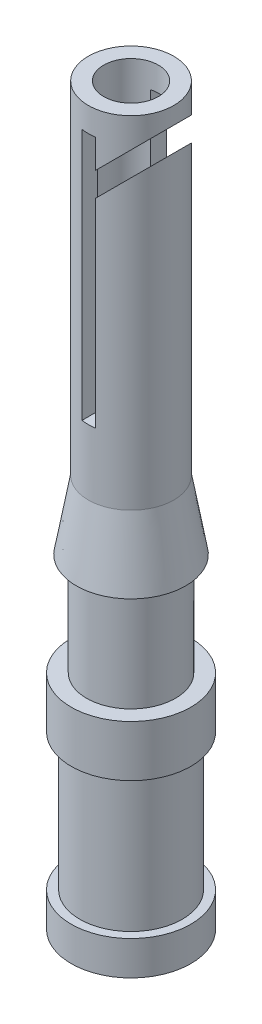
ISO-10303-21;
HEADER;
FILE_DESCRIPTION(('STEP AP214'),'2;1');
FILE_NAME('part.step','',(''),(''),'','','');
FILE_SCHEMA(('AUTOMOTIVE_DESIGN { 1 0 10303 214 1 1 1 1 }'));
ENDSEC;
DATA;
#1=APPLICATION_CONTEXT('core data for automotive mechanical design processes');
#2=APPLICATION_PROTOCOL_DEFINITION('international standard','automotive_design',2000,#1);
#3=PRODUCT_CONTEXT('',#1,'mechanical');
#4=PRODUCT('Part','Part','',(#3));
#5=PRODUCT_RELATED_PRODUCT_CATEGORY('part','',(#4));
#6=PRODUCT_DEFINITION_FORMATION('','',#4);
#7=PRODUCT_DEFINITION_CONTEXT('part definition',#1,'design');
#8=PRODUCT_DEFINITION('design','',#6,#7);
#9=PRODUCT_DEFINITION_SHAPE('','',#8);
#10=(LENGTH_UNIT() NAMED_UNIT(*) SI_UNIT(.MILLI.,.METRE.));
#11=(NAMED_UNIT(*) PLANE_ANGLE_UNIT() SI_UNIT($,.RADIAN.));
#12=(NAMED_UNIT(*) SI_UNIT($,.STERADIAN.) SOLID_ANGLE_UNIT());
#13=UNCERTAINTY_MEASURE_WITH_UNIT(LENGTH_MEASURE(1.E-05),#10,'distance_accuracy_value','');
#14=(GEOMETRIC_REPRESENTATION_CONTEXT(3) GLOBAL_UNCERTAINTY_ASSIGNED_CONTEXT((#13)) GLOBAL_UNIT_ASSIGNED_CONTEXT((#10,
#11,#12)) REPRESENTATION_CONTEXT('',''));
#15=CARTESIAN_POINT('',(0.,0.,0.));
#16=DIRECTION('',(0.,0.,1.));
#17=DIRECTION('',(1.,0.,0.));
#18=AXIS2_PLACEMENT_3D('',#15,#16,#17);
#19=CARTESIAN_POINT('',(1.2974998703602,8.000000590086,-14.7475));
#20=DIRECTION('',(0.,-1.,0.));
#21=DIRECTION('',(0.,0.,1.));
#22=AXIS2_PLACEMENT_3D('',#19,#20,#21);
#23=PLANE('',#22);
#24=CARTESIAN_POINT('',(0.49999987035989,8.00000059008601,-13.95));
#25=DIRECTION('',(0.,1.,0.));
#26=DIRECTION('',(-1.,0.,0.));
#27=AXIS2_PLACEMENT_3D('',#24,#25,#26);
#28=CIRCLE('',#27,0.725000000000362);
#29=CARTESIAN_POINT('',(-0.225000129640472,8.000000590086,-13.95));
#30=VERTEX_POINT('',#29);
#31=EDGE_CURVE('E20',#30,#30,#28,.T.);
#32=ORIENTED_EDGE('',*,*,#31,.F.);
#33=EDGE_LOOP('',(#32));
#34=FACE_BOUND('',#33,.T.);
#35=ADVANCED_FACE('F16',(#34),#23,.T.);
#36=CARTESIAN_POINT('',(0.499999870360045,5.90085959E-07,-13.95));
#37=DIRECTION('',(0.,1.,0.));
#38=DIRECTION('',(-1.,0.,0.));
#39=AXIS2_PLACEMENT_3D('',#36,#37,#38);
#40=CYLINDRICAL_SURFACE('',#39,0.725000000000362);
#41=CARTESIAN_POINT('',(0.499999870360045,5.90085987E-07,-13.95));
#42=DIRECTION('',(0.,1.,0.));
#43=DIRECTION('',(-1.,0.,0.));
#44=AXIS2_PLACEMENT_3D('',#41,#42,#43);
#45=CIRCLE('',#44,0.725000000000362);
#46=CARTESIAN_POINT('',(-0.225000129640317,5.90085973E-07,-13.95));
#47=VERTEX_POINT('',#46);
#48=EDGE_CURVE('E214',#47,#47,#45,.T.);
#49=ORIENTED_EDGE('',*,*,#48,.F.);
#50=EDGE_LOOP('',(#49));
#51=FACE_BOUND('',#50,.T.);
#52=ORIENTED_EDGE('',*,*,#31,.T.);
#53=EDGE_LOOP('',(#52));
#54=FACE_BOUND('',#53,.T.);
#55=ADVANCED_FACE('F221',(#51,#54),#40,.F.);
#56=CARTESIAN_POINT('',(2.4249998703601,5.90085973E-07,-15.875));
#57=DIRECTION('',(0.,-1.,0.));
#58=DIRECTION('',(0.,0.,1.));
#59=AXIS2_PLACEMENT_3D('',#56,#57,#58);
#60=PLANE('',#59);
#61=ORIENTED_EDGE('',*,*,#48,.T.);
#62=EDGE_LOOP('',(#61));
#63=FACE_BOUND('',#62,.T.);
#64=CARTESIAN_POINT('',(0.499999870360085,5.90085986150457E-07,-13.95));
#65=DIRECTION('',(0.,-1.,0.));
#66=DIRECTION('',(0.,0.,-1.));
#67=AXIS2_PLACEMENT_3D('',#64,#65,#66);
#68=CIRCLE('',#67,1.75000000000008);
#69=CARTESIAN_POINT('',(0.499999870360085,5.90085963114966E-07,-15.7000000000001));
#70=VERTEX_POINT('',#69);
#71=EDGE_CURVE('E212',#70,#70,#68,.F.);
#72=ORIENTED_EDGE('',*,*,#71,.F.);
#73=EDGE_LOOP('',(#72));
#74=FACE_BOUND('',#73,.T.);
#75=ADVANCED_FACE('F231',(#63,#74),#60,.T.);
#76=CARTESIAN_POINT('',(0.499999870360078,1.00000059008601,-13.95));
#77=DIRECTION('',(0.,-1.,0.));
#78=DIRECTION('',(0.,0.,-1.));
#79=AXIS2_PLACEMENT_3D('',#76,#77,#78);
#80=CYLINDRICAL_SURFACE('',#79,1.75000000000008);
#81=CARTESIAN_POINT('',(0.499999870360078,1.00000059008601,-13.95));
#82=DIRECTION('',(0.,-1.,0.));
#83=DIRECTION('',(0.,0.,-1.));
#84=AXIS2_PLACEMENT_3D('',#81,#82,#83);
#85=CIRCLE('',#84,1.75000000000008);
#86=CARTESIAN_POINT('',(0.499999870360078,1.00000059008599,-15.7000000000001));
#87=VERTEX_POINT('',#86);
#88=EDGE_CURVE('E209',#87,#87,#85,.F.);
#89=ORIENTED_EDGE('',*,*,#88,.F.);
#90=EDGE_LOOP('',(#89));
#91=FACE_BOUND('',#90,.T.);
#92=ORIENTED_EDGE('',*,*,#71,.T.);
#93=EDGE_LOOP('',(#92));
#94=FACE_BOUND('',#93,.T.);
#95=ADVANCED_FACE('F374',(#91,#94),#80,.T.);
#96=CARTESIAN_POINT('',(-1.4250001296399,1.000000590086,-15.875));
#97=DIRECTION('',(0.,1.,0.));
#98=DIRECTION('',(0.,0.,1.));
#99=AXIS2_PLACEMENT_3D('',#96,#97,#98);
#100=PLANE('',#99);
#101=CARTESIAN_POINT('',(0.499999870360038,1.00000059008603,-13.9500000000002));
#102=DIRECTION('',(0.,-1.,0.));
#103=DIRECTION('',(0.,0.,-1.));
#104=AXIS2_PLACEMENT_3D('',#101,#102,#103);
#105=CIRCLE('',#104,1.50000000000025);
#106=CARTESIAN_POINT('',(0.499999870360038,1.00000059008609,-15.4500000000004));
#107=VERTEX_POINT('',#106);
#108=EDGE_CURVE('E206',#107,#107,#105,.F.);
#109=ORIENTED_EDGE('',*,*,#108,.F.);
#110=EDGE_LOOP('',(#109));
#111=FACE_BOUND('',#110,.T.);
#112=ORIENTED_EDGE('',*,*,#88,.T.);
#113=EDGE_LOOP('',(#112));
#114=FACE_BOUND('',#113,.T.);
#115=ADVANCED_FACE('F370',(#111,#114),#100,.T.);
#116=CARTESIAN_POINT('',(0.499999870359948,5.00000059008593,-13.95));
#117=DIRECTION('',(0.,-1.,0.));
#118=DIRECTION('',(0.,0.,-1.));
#119=AXIS2_PLACEMENT_3D('',#116,#117,#118);
#120=CYLINDRICAL_SURFACE('',#119,1.50000000000025);
#121=CARTESIAN_POINT('',(0.499999870359948,5.00000059008604,-13.95));
#122=DIRECTION('',(0.,-1.,0.));
#123=DIRECTION('',(0.,0.,-1.));
#124=AXIS2_PLACEMENT_3D('',#121,#122,#123);
#125=CIRCLE('',#124,1.50000000000025);
#126=CARTESIAN_POINT('',(0.499999870359948,5.00000059008609,-15.4500000000003));
#127=VERTEX_POINT('',#126);
#128=EDGE_CURVE('E203',#127,#127,#125,.F.);
#129=ORIENTED_EDGE('',*,*,#128,.F.);
#130=EDGE_LOOP('',(#129));
#131=FACE_BOUND('',#130,.T.);
#132=ORIENTED_EDGE('',*,*,#108,.T.);
#133=EDGE_LOOP('',(#132));
#134=FACE_BOUND('',#133,.T.);
#135=ADVANCED_FACE('F366',(#131,#134),#120,.T.);
#136=CARTESIAN_POINT('',(2.4249998703599,5.000000590086,-15.875));
#137=DIRECTION('',(0.,-1.,0.));
#138=DIRECTION('',(0.,0.,1.));
#139=AXIS2_PLACEMENT_3D('',#136,#137,#138);
#140=PLANE('',#139);
#141=ORIENTED_EDGE('',*,*,#128,.T.);
#142=EDGE_LOOP('',(#141));
#143=FACE_BOUND('',#142,.T.);
#144=CARTESIAN_POINT('',(0.499999870359954,5.00000059008604,-13.9500000000001));
#145=DIRECTION('',(0.,-1.,0.));
#146=DIRECTION('',(0.,0.,-1.));
#147=AXIS2_PLACEMENT_3D('',#144,#145,#146);
#148=CIRCLE('',#147,1.74999999999999);
#149=CARTESIAN_POINT('',(0.499999870359954,5.00000059008609,-15.7000000000001));
#150=VERTEX_POINT('',#149);
#151=EDGE_CURVE('E200',#150,#150,#148,.F.);
#152=ORIENTED_EDGE('',*,*,#151,.F.);
#153=EDGE_LOOP('',(#152));
#154=FACE_BOUND('',#153,.T.);
#155=ADVANCED_FACE('F362',(#143,#154),#140,.T.);
#156=CARTESIAN_POINT('',(0.499999870359925,6.50000059008593,-13.95));
#157=DIRECTION('',(0.,-1.,0.));
#158=DIRECTION('',(0.,0.,-1.));
#159=AXIS2_PLACEMENT_3D('',#156,#157,#158);
#160=CYLINDRICAL_SURFACE('',#159,1.74999999999999);
#161=CARTESIAN_POINT('',(0.499999870359925,6.50000059008603,-13.95));
#162=DIRECTION('',(0.,-1.,0.));
#163=DIRECTION('',(0.,0.,-1.));
#164=AXIS2_PLACEMENT_3D('',#161,#162,#163);
#165=CIRCLE('',#164,1.74999999999999);
#166=CARTESIAN_POINT('',(0.499999870359925,6.50000059008609,-15.7));
#167=VERTEX_POINT('',#166);
#168=EDGE_CURVE('E197',#167,#167,#165,.F.);
#169=ORIENTED_EDGE('',*,*,#168,.F.);
#170=EDGE_LOOP('',(#169));
#171=FACE_BOUND('',#170,.T.);
#172=ORIENTED_EDGE('',*,*,#151,.T.);
#173=EDGE_LOOP('',(#172));
#174=FACE_BOUND('',#173,.T.);
#175=ADVANCED_FACE('F358',(#171,#174),#160,.T.);
#176=CARTESIAN_POINT('',(-1.4250001296399,6.500000590086,-15.875));
#177=DIRECTION('',(0.,1.,0.));
#178=DIRECTION('',(0.,0.,1.));
#179=AXIS2_PLACEMENT_3D('',#176,#177,#178);
#180=PLANE('',#179);
#181=CARTESIAN_POINT('',(0.499999870360003,6.50000059008603,-13.9500000000001));
#182=DIRECTION('',(0.,-1.,0.));
#183=DIRECTION('',(0.,0.,-1.));
#184=AXIS2_PLACEMENT_3D('',#181,#182,#183);
#185=CIRCLE('',#184,1.30000000000019);
#186=CARTESIAN_POINT('',(0.499999870360003,6.50000059008609,-15.2500000000003));
#187=VERTEX_POINT('',#186);
#188=EDGE_CURVE('E194',#187,#187,#185,.F.);
#189=ORIENTED_EDGE('',*,*,#188,.F.);
#190=EDGE_LOOP('',(#189));
#191=FACE_BOUND('',#190,.T.);
#192=ORIENTED_EDGE('',*,*,#168,.T.);
#193=EDGE_LOOP('',(#192));
#194=FACE_BOUND('',#193,.T.);
#195=ADVANCED_FACE('F354',(#191,#194),#180,.T.);
#196=CARTESIAN_POINT('',(0.499999870359924,9.50000059008593,-13.95));
#197=DIRECTION('',(0.,-1.,0.));
#198=DIRECTION('',(0.,0.,-1.));
#199=AXIS2_PLACEMENT_3D('',#196,#197,#198);
#200=CYLINDRICAL_SURFACE('',#199,1.30000000000019);
#201=CARTESIAN_POINT('',(0.499999870359924,9.50000059008604,-13.95));
#202=DIRECTION('',(0.,-1.,0.));
#203=DIRECTION('',(0.,0.,-1.));
#204=AXIS2_PLACEMENT_3D('',#201,#202,#203);
#205=CIRCLE('',#204,1.30000000000019);
#206=CARTESIAN_POINT('',(0.499999870359924,9.5000005900861,-15.2500000000002));
#207=VERTEX_POINT('',#206);
#208=EDGE_CURVE('E191',#207,#207,#205,.F.);
#209=ORIENTED_EDGE('',*,*,#208,.F.);
#210=EDGE_LOOP('',(#209));
#211=FACE_BOUND('',#210,.T.);
#212=ORIENTED_EDGE('',*,*,#188,.T.);
#213=EDGE_LOOP('',(#212));
#214=FACE_BOUND('',#213,.T.);
#215=ADVANCED_FACE('F350',(#211,#214),#200,.T.);
#216=CARTESIAN_POINT('',(-0.38000012964019,12.500000590086,-14.83));
#217=DIRECTION('',(0.,1.,0.));
#218=DIRECTION('',(0.,0.,1.));
#219=AXIS2_PLACEMENT_3D('',#216,#217,#218);
#220=PLANE('',#219);
#221=CARTESIAN_POINT('',(0.499999870359857,12.500000590086,-13.95));
#222=DIRECTION('',(0.,1.,0.));
#223=DIRECTION('',(0.,0.,1.));
#224=AXIS2_PLACEMENT_3D('',#221,#222,#223);
#225=CIRCLE('',#224,0.800000000000202);
#226=CARTESIAN_POINT('',(0.499999870359857,12.500000590086,-13.1499999999998));
#227=VERTEX_POINT('',#226);
#228=EDGE_CURVE('E188',#227,#227,#225,.F.);
#229=ORIENTED_EDGE('',*,*,#228,.F.);
#230=EDGE_LOOP('',(#229));
#231=FACE_BOUND('',#230,.T.);
#232=ADVANCED_FACE('F346',(#231),#220,.T.);
#233=CARTESIAN_POINT('',(2.2599998703599,9.500000590086,-15.71));
#234=DIRECTION('',(0.,-1.,0.));
#235=DIRECTION('',(0.,0.,1.));
#236=AXIS2_PLACEMENT_3D('',#233,#234,#235);
#237=PLANE('',#236);
#238=ORIENTED_EDGE('',*,*,#208,.T.);
#239=EDGE_LOOP('',(#238));
#240=FACE_BOUND('',#239,.T.);
#241=CARTESIAN_POINT('',(0.499999870359763,9.500000590086,-13.95));
#242=DIRECTION('',(0.,-1.,0.));
#243=DIRECTION('',(0.,0.,-1.));
#244=AXIS2_PLACEMENT_3D('',#241,#242,#243);
#245=CIRCLE('',#244,1.59999999999985);
#246=CARTESIAN_POINT('',(0.499999870359763,9.500000590086,-15.5499999999998));
#247=VERTEX_POINT('',#246);
#248=EDGE_CURVE('E123',#247,#247,#245,.F.);
#249=ORIENTED_EDGE('',*,*,#248,.F.);
#250=EDGE_LOOP('',(#249));
#251=FACE_BOUND('',#250,.T.);
#252=ADVANCED_FACE('F342',(#240,#251),#237,.T.);
#253=CARTESIAN_POINT('',(0.499999870359857,12.500000590086,-13.95));
#254=DIRECTION('',(0.,1.,0.));
#255=DIRECTION('',(0.,0.,1.));
#256=AXIS2_PLACEMENT_3D('',#253,#254,#255);
#257=CYLINDRICAL_SURFACE('',#256,0.800000000000202);
#258=ORIENTED_EDGE('',*,*,#228,.T.);
#259=EDGE_LOOP('',(#258));
#260=FACE_BOUND('',#259,.T.);
#261=DIRECTION('',(0.,-1.,0.));
#262=VECTOR('',#261,1.);
#263=CARTESIAN_POINT('',(0.29999987035979,17.1000005900855,-13.175403330759));
#264=LINE('',#263,#262);
#265=CARTESIAN_POINT('',(0.29999987035972,20.787479403584,-13.1754033307587));
#266=VERTEX_POINT('',#265);
#267=CARTESIAN_POINT('',(0.29999987035986,13.412521776587,-13.1754033307587));
#268=VERTEX_POINT('',#267);
#269=EDGE_CURVE('E104',#266,#268,#264,.T.);
#270=ORIENTED_EDGE('',*,*,#269,.T.);
#271=CARTESIAN_POINT('',(0.499999870359857,13.412521776587,-13.95));
#272=DIRECTION('',(0.,1.,0.));
#273=DIRECTION('',(0.,0.,1.));
#274=AXIS2_PLACEMENT_3D('',#271,#272,#273);
#275=CIRCLE('',#274,0.800000000000202);
#276=CARTESIAN_POINT('',(0.69999987035986,13.412521776587,-13.1754033307587));
#277=VERTEX_POINT('',#276);
#278=EDGE_CURVE('E106',#268,#277,#275,.T.);
#279=ORIENTED_EDGE('',*,*,#278,.T.);
#280=DIRECTION('',(0.,1.,0.));
#281=VECTOR('',#280,1.);
#282=CARTESIAN_POINT('',(0.699999870359805,16.327707792743,-13.175403330759));
#283=LINE('',#282,#281);
#284=CARTESIAN_POINT('',(0.69999987035975,19.242893808899,-13.1754033307586));
#285=VERTEX_POINT('',#284);
#286=EDGE_CURVE('E110',#277,#285,#283,.T.);
#287=ORIENTED_EDGE('',*,*,#286,.T.);
#288=CARTESIAN_POINT('',(0.499999870359857,19.0428938088991,-13.95));
#289=DIRECTION('',(0.707106781186564,-0.707106781186531,0.));
#290=DIRECTION('',(0.707106781186531,0.707106781186564,0.));
#291=AXIS2_PLACEMENT_3D('',#288,#289,#290);
#292=ELLIPSE('',#291,1.13137084989879,0.800000000000202);
#293=CARTESIAN_POINT('',(0.69999987035975,19.242893808899,-14.7245966692419));
#294=VERTEX_POINT('',#293);
#295=EDGE_CURVE('E173',#285,#294,#292,.F.);
#296=ORIENTED_EDGE('',*,*,#295,.T.);
#297=DIRECTION('',(0.,-1.,0.));
#298=VECTOR('',#297,1.);
#299=CARTESIAN_POINT('',(0.699999870359805,16.327707792743,-14.724596669242));
#300=LINE('',#299,#298);
#301=CARTESIAN_POINT('',(0.69999987035986,13.412521776587,-14.7245966692418));
#302=VERTEX_POINT('',#301);
#303=EDGE_CURVE('E135',#294,#302,#300,.T.);
#304=ORIENTED_EDGE('',*,*,#303,.T.);
#305=CARTESIAN_POINT('',(0.499999870359857,13.412521776587,-13.95));
#306=DIRECTION('',(0.,1.,0.));
#307=DIRECTION('',(0.,0.,1.));
#308=AXIS2_PLACEMENT_3D('',#305,#306,#307);
#309=CIRCLE('',#308,0.800000000000202);
#310=CARTESIAN_POINT('',(0.29999987035986,13.412521776587,-14.7245966692418));
#311=VERTEX_POINT('',#310);
#312=EDGE_CURVE('E175',#302,#311,#309,.T.);
#313=ORIENTED_EDGE('',*,*,#312,.T.);
#314=DIRECTION('',(0.,1.,0.));
#315=VECTOR('',#314,1.);
#316=CARTESIAN_POINT('',(0.29999987035979,17.1000005900855,-14.724596669242));
#317=LINE('',#316,#315);
#318=CARTESIAN_POINT('',(0.29999987035972,20.787479403584,-14.7245966692418));
#319=VERTEX_POINT('',#318);
#320=EDGE_CURVE('E139',#311,#319,#317,.T.);
#321=ORIENTED_EDGE('',*,*,#320,.T.);
#322=CARTESIAN_POINT('',(0.499999870359857,20.787479403584,-13.95));
#323=DIRECTION('',(0.,1.,0.));
#324=DIRECTION('',(0.,0.,1.));
#325=AXIS2_PLACEMENT_3D('',#322,#323,#324);
#326=CIRCLE('',#325,0.800000000000202);
#327=CARTESIAN_POINT('',(0.69999987035972,20.787479403584,-14.7245966692419));
#328=VERTEX_POINT('',#327);
#329=EDGE_CURVE('E177',#319,#328,#326,.F.);
#330=ORIENTED_EDGE('',*,*,#329,.T.);
#331=DIRECTION('',(0.,-1.,0.));
#332=VECTOR('',#331,1.);
#333=CARTESIAN_POINT('',(0.699999870359725,20.368739996835,-14.724596669242));
#334=LINE('',#333,#332);
#335=CARTESIAN_POINT('',(0.69999987035973,19.950000590086,-14.7245966692419));
#336=VERTEX_POINT('',#335);
#337=EDGE_CURVE('E143',#328,#336,#334,.T.);
#338=ORIENTED_EDGE('',*,*,#337,.T.);
#339=CARTESIAN_POINT('',(0.499999870359857,19.7500005900861,-13.95));
#340=DIRECTION('',(-0.707106781186557,0.707106781186538,0.));
#341=DIRECTION('',(0.707106781186538,0.707106781186557,0.));
#342=AXIS2_PLACEMENT_3D('',#339,#340,#341);
#343=ELLIPSE('',#342,1.13137084989878,0.800000000000202);
#344=CARTESIAN_POINT('',(0.69999987035973,19.950000590086,-13.1754033307586));
#345=VERTEX_POINT('',#344);
#346=EDGE_CURVE('E179',#336,#345,#343,.F.);
#347=ORIENTED_EDGE('',*,*,#346,.T.);
#348=DIRECTION('',(0.,1.,0.));
#349=VECTOR('',#348,1.);
#350=CARTESIAN_POINT('',(0.699999870359725,20.368739996835,-13.175403330759));
#351=LINE('',#350,#349);
#352=CARTESIAN_POINT('',(0.69999987035972,20.787479403584,-13.1754033307586));
#353=VERTEX_POINT('',#352);
#354=EDGE_CURVE('E147',#345,#353,#351,.T.);
#355=ORIENTED_EDGE('',*,*,#354,.T.);
#356=CARTESIAN_POINT('',(0.499999870359857,20.787479403584,-13.95));
#357=DIRECTION('',(0.,1.,0.));
#358=DIRECTION('',(0.,0.,1.));
#359=AXIS2_PLACEMENT_3D('',#356,#357,#358);
#360=CIRCLE('',#359,0.800000000000202);
#361=EDGE_CURVE('E181',#353,#266,#360,.F.);
#362=ORIENTED_EDGE('',*,*,#361,.T.);
#363=EDGE_LOOP('',(#270,#279,#287,#296,#304,#313,#321,#330,#338,#347,#355,#362));
#364=FACE_BOUND('',#363,.T.);
#365=CARTESIAN_POINT('',(0.499999870359857,21.500000590086,-13.95));
#366=DIRECTION('',(0.,1.,0.));
#367=DIRECTION('',(0.,0.,1.));
#368=AXIS2_PLACEMENT_3D('',#365,#366,#367);
#369=CIRCLE('',#368,0.800000000000202);
#370=CARTESIAN_POINT('',(0.499999870359857,21.500000590086,-13.1499999999998));
#371=VERTEX_POINT('',#370);
#372=EDGE_CURVE('E185',#371,#371,#369,.F.);
#373=ORIENTED_EDGE('',*,*,#372,.F.);
#374=EDGE_LOOP('',(#373));
#375=FACE_BOUND('',#374,.T.);
#376=ADVANCED_FACE('F108',(#260,#364,#375),#257,.F.);
#377=CARTESIAN_POINT('',(-0.87500012964023,21.500000590086,-15.325));
#378=DIRECTION('',(0.,1.,0.));
#379=DIRECTION('',(0.,0.,1.));
#380=AXIS2_PLACEMENT_3D('',#377,#378,#379);
#381=PLANE('',#380);
#382=ORIENTED_EDGE('',*,*,#372,.T.);
#383=EDGE_LOOP('',(#382));
#384=FACE_BOUND('',#383,.T.);
#385=CARTESIAN_POINT('',(0.499999870359726,21.500000590086,-13.95));
#386=DIRECTION('',(0.,-1.,0.));
#387=DIRECTION('',(0.,0.,-1.));
#388=AXIS2_PLACEMENT_3D('',#385,#386,#387);
#389=CIRCLE('',#388,1.25000000000014);
#390=CARTESIAN_POINT('',(0.499999870359726,21.500000590086,-15.2000000000001));
#391=VERTEX_POINT('',#390);
#392=EDGE_CURVE('E169',#391,#391,#389,.T.);
#393=ORIENTED_EDGE('',*,*,#392,.F.);
#394=EDGE_LOOP('',(#393));
#395=FACE_BOUND('',#394,.T.);
#396=ADVANCED_FACE('F336',(#384,#395),#381,.T.);
#397=CARTESIAN_POINT('',(0.499999870359763,11.500000590086,-13.95));
#398=DIRECTION('',(0.,-1.,0.));
#399=DIRECTION('',(0.,0.,-1.));
#400=AXIS2_PLACEMENT_3D('',#397,#398,#399);
#401=CONICAL_SURFACE('',#400,1.24999999999999,0.173245666452293);
#402=CARTESIAN_POINT('',(0.499999870359763,11.500000590086,-13.95));
#403=DIRECTION('',(0.,1.,0.));
#404=DIRECTION('',(0.,0.,1.));
#405=AXIS2_PLACEMENT_3D('',#402,#403,#404);
#406=CIRCLE('',#405,1.25000000000022);
#407=CARTESIAN_POINT('',(0.499999870359763,11.500000590086,-12.6999999999998));
#408=VERTEX_POINT('',#407);
#409=EDGE_CURVE('E172',#408,#408,#406,.T.);
#410=ORIENTED_EDGE('',*,*,#409,.F.);
#411=EDGE_LOOP('',(#410));
#412=FACE_BOUND('',#411,.T.);
#413=ORIENTED_EDGE('',*,*,#248,.T.);
#414=EDGE_LOOP('',(#413));
#415=FACE_BOUND('',#414,.T.);
#416=ADVANCED_FACE('F333',(#412,#415),#401,.T.);
#417=CARTESIAN_POINT('',(0.69999987035986,13.412521776587,-16.183896267925));
#418=DIRECTION('',(1.,0.,0.));
#419=DIRECTION('',(0.,1.,0.));
#420=AXIS2_PLACEMENT_3D('',#417,#418,#419);
#421=PLANE('',#420);
#422=DIRECTION('',(0.,-1.,0.));
#423=VECTOR('',#422,1.);
#424=CARTESIAN_POINT('',(0.699999870359507,16.500000590086,-12.7161037320747));
#425=LINE('',#424,#423);
#426=CARTESIAN_POINT('',(0.699999870359607,19.2428938088989,-12.7161037320747));
#427=VERTEX_POINT('',#426);
#428=CARTESIAN_POINT('',(0.699999870359707,13.412521776587,-12.7161037320745));
#429=VERTEX_POINT('',#428);
#430=EDGE_CURVE('E168',#427,#429,#425,.T.);
#431=ORIENTED_EDGE('',*,*,#430,.F.);
#432=DIRECTION('',(0.,0.,-1.));
#433=VECTOR('',#432,1.);
#434=CARTESIAN_POINT('',(0.69999987035975,19.242893808899,-13.95));
#435=LINE('',#434,#433);
#436=EDGE_CURVE('E121',#427,#285,#435,.T.);
#437=ORIENTED_EDGE('',*,*,#436,.T.);
#438=ORIENTED_EDGE('',*,*,#286,.F.);
#439=DIRECTION('',(0.,0.,1.));
#440=VECTOR('',#439,1.);
#441=CARTESIAN_POINT('',(0.69999987035986,13.412521776587,-13.95));
#442=LINE('',#441,#440);
#443=EDGE_CURVE('E115',#277,#429,#442,.T.);
#444=ORIENTED_EDGE('',*,*,#443,.T.);
#445=EDGE_LOOP('',(#431,#437,#438,#444));
#446=FACE_BOUND('',#445,.T.);
#447=ADVANCED_FACE('F118',(#446),#421,.F.);
#448=CARTESIAN_POINT('',(0.29999987035986,13.412521776587,-16.2));
#449=DIRECTION('',(0.,-1.,0.));
#450=DIRECTION('',(1.,0.,0.));
#451=AXIS2_PLACEMENT_3D('',#448,#449,#450);
#452=PLANE('',#451);
#453=CARTESIAN_POINT('',(0.499999870359726,13.412521776587,-13.95));
#454=DIRECTION('',(0.,-1.,0.));
#455=DIRECTION('',(0.,0.,-1.));
#456=AXIS2_PLACEMENT_3D('',#453,#454,#455);
#457=CIRCLE('',#456,1.25000000000014);
#458=CARTESIAN_POINT('',(0.299999870359821,13.412521776587,-12.7161037320745));
#459=VERTEX_POINT('',#458);
#460=EDGE_CURVE('E127',#429,#459,#457,.T.);
#461=ORIENTED_EDGE('',*,*,#460,.F.);
#462=ORIENTED_EDGE('',*,*,#443,.F.);
#463=ORIENTED_EDGE('',*,*,#278,.F.);
#464=DIRECTION('',(0.,0.,1.));
#465=VECTOR('',#464,1.);
#466=CARTESIAN_POINT('',(0.29999987035986,13.412521776587,-13.95));
#467=LINE('',#466,#465);
#468=EDGE_CURVE('E130',#268,#459,#467,.T.);
#469=ORIENTED_EDGE('',*,*,#468,.T.);
#470=EDGE_LOOP('',(#461,#462,#463,#469));
#471=FACE_BOUND('',#470,.T.);
#472=ADVANCED_FACE('F125',(#471),#452,.F.);
#473=CARTESIAN_POINT('',(0.29999987035972,20.787479403584,-16.183896267925));
#474=DIRECTION('',(-1.,0.,0.));
#475=DIRECTION('',(0.,-1.,0.));
#476=AXIS2_PLACEMENT_3D('',#473,#474,#475);
#477=PLANE('',#476);
#478=DIRECTION('',(0.,1.,0.));
#479=VECTOR('',#478,1.);
#480=CARTESIAN_POINT('',(0.299999870359748,16.500000590086,-12.7161037320747));
#481=LINE('',#480,#479);
#482=CARTESIAN_POINT('',(0.29999987035971,20.787479403584,-12.7161037320748));
#483=VERTEX_POINT('',#482);
#484=EDGE_CURVE('E166',#459,#483,#481,.T.);
#485=ORIENTED_EDGE('',*,*,#484,.F.);
#486=ORIENTED_EDGE('',*,*,#468,.F.);
#487=ORIENTED_EDGE('',*,*,#269,.F.);
#488=DIRECTION('',(0.,0.,1.));
#489=VECTOR('',#488,1.);
#490=CARTESIAN_POINT('',(0.29999987035972,20.787479403584,-13.95));
#491=LINE('',#490,#489);
#492=EDGE_CURVE('E149',#266,#483,#491,.T.);
#493=ORIENTED_EDGE('',*,*,#492,.T.);
#494=EDGE_LOOP('',(#485,#486,#487,#493));
#495=FACE_BOUND('',#494,.T.);
#496=ADVANCED_FACE('F270',(#495),#477,.F.);
#497=CARTESIAN_POINT('',(0.69999987035972,20.787479403584,-16.2));
#498=DIRECTION('',(0.,1.,0.));
#499=DIRECTION('',(-1.,0.,0.));
#500=AXIS2_PLACEMENT_3D('',#497,#498,#499);
#501=PLANE('',#500);
#502=CARTESIAN_POINT('',(0.499999870359726,20.787479403584,-13.95));
#503=DIRECTION('',(0.,-1.,0.));
#504=DIRECTION('',(0.,0.,-1.));
#505=AXIS2_PLACEMENT_3D('',#502,#503,#504);
#506=CIRCLE('',#505,1.25000000000014);
#507=CARTESIAN_POINT('',(0.699999870359714,20.787479403584,-12.7161037320748));
#508=VERTEX_POINT('',#507);
#509=EDGE_CURVE('E163',#483,#508,#506,.F.);
#510=ORIENTED_EDGE('',*,*,#509,.F.);
#511=ORIENTED_EDGE('',*,*,#492,.F.);
#512=ORIENTED_EDGE('',*,*,#361,.F.);
#513=DIRECTION('',(0.,0.,1.));
#514=VECTOR('',#513,1.);
#515=CARTESIAN_POINT('',(0.69999987035972,20.787479403584,-13.95));
#516=LINE('',#515,#514);
#517=EDGE_CURVE('E148',#353,#508,#516,.T.);
#518=ORIENTED_EDGE('',*,*,#517,.T.);
#519=EDGE_LOOP('',(#510,#511,#512,#518));
#520=FACE_BOUND('',#519,.T.);
#521=ADVANCED_FACE('F274',(#520),#501,.F.);
#522=CARTESIAN_POINT('',(0.69999987035973,19.950000590086,-16.183896267925));
#523=DIRECTION('',(1.,0.,0.));
#524=DIRECTION('',(0.,1.,0.));
#525=AXIS2_PLACEMENT_3D('',#522,#523,#524);
#526=PLANE('',#525);
#527=DIRECTION('',(0.,-1.,0.));
#528=VECTOR('',#527,1.);
#529=CARTESIAN_POINT('',(0.699999870359774,16.500000590086,-12.7161037320747));
#530=LINE('',#529,#528);
#531=CARTESIAN_POINT('',(0.699999870359725,19.950000590086,-12.7161037320748));
#532=VERTEX_POINT('',#531);
#533=EDGE_CURVE('E162',#508,#532,#530,.T.);
#534=ORIENTED_EDGE('',*,*,#533,.F.);
#535=ORIENTED_EDGE('',*,*,#517,.F.);
#536=ORIENTED_EDGE('',*,*,#354,.F.);
#537=DIRECTION('',(0.,0.,1.));
#538=VECTOR('',#537,1.);
#539=CARTESIAN_POINT('',(0.69999987035973,19.950000590086,-13.95));
#540=LINE('',#539,#538);
#541=EDGE_CURVE('E146',#345,#532,#540,.T.);
#542=ORIENTED_EDGE('',*,*,#541,.T.);
#543=EDGE_LOOP('',(#534,#535,#536,#542));
#544=FACE_BOUND('',#543,.T.);
#545=ADVANCED_FACE('F279',(#544),#526,.F.);
#546=CARTESIAN_POINT('',(1.7604998703597,21.010500590086,-16.183896267925));
#547=DIRECTION('',(-0.707106781186557,0.707106781186538,0.));
#548=DIRECTION('',(-0.707106781186538,-0.707106781186557,0.));
#549=AXIS2_PLACEMENT_3D('',#546,#547,#548);
#550=PLANE('',#549);
#551=CARTESIAN_POINT('',(0.499999870359726,19.750000590086,-13.95));
#552=DIRECTION('',(-0.707106781186557,0.707106781186538,0.));
#553=DIRECTION('',(-0.707106781186538,-0.707106781186557,0.));
#554=AXIS2_PLACEMENT_3D('',#551,#552,#553);
#555=ELLIPSE('',#554,1.7677669529666,1.25000000000014);
#556=CARTESIAN_POINT('',(0.699999870359782,19.9500005900861,-15.1838962679255));
#557=VERTEX_POINT('',#556);
#558=EDGE_CURVE('E159',#532,#557,#555,.T.);
#559=ORIENTED_EDGE('',*,*,#558,.F.);
#560=ORIENTED_EDGE('',*,*,#541,.F.);
#561=ORIENTED_EDGE('',*,*,#346,.F.);
#562=DIRECTION('',(0.,0.,-1.));
#563=VECTOR('',#562,1.);
#564=CARTESIAN_POINT('',(0.69999987035973,19.950000590086,-13.95));
#565=LINE('',#564,#563);
#566=EDGE_CURVE('E145',#336,#557,#565,.T.);
#567=ORIENTED_EDGE('',*,*,#566,.T.);
#568=EDGE_LOOP('',(#559,#560,#561,#567));
#569=FACE_BOUND('',#568,.T.);
#570=ADVANCED_FACE('F319',(#569),#550,.F.);
#571=CARTESIAN_POINT('',(0.69999987035973,19.950000590086,-16.183896267925));
#572=DIRECTION('',(1.,0.,0.));
#573=DIRECTION('',(0.,1.,0.));
#574=AXIS2_PLACEMENT_3D('',#571,#572,#573);
#575=PLANE('',#574);
#576=DIRECTION('',(0.,1.,0.));
#577=VECTOR('',#576,1.);
#578=CARTESIAN_POINT('',(0.699999870359886,16.500000590086,-15.1838962679257));
#579=LINE('',#578,#577);
#580=CARTESIAN_POINT('',(0.69999987035977,20.787479403584,-15.1838962679255));
#581=VERTEX_POINT('',#580);
#582=EDGE_CURVE('E158',#557,#581,#579,.T.);
#583=ORIENTED_EDGE('',*,*,#582,.F.);
#584=ORIENTED_EDGE('',*,*,#566,.F.);
#585=ORIENTED_EDGE('',*,*,#337,.F.);
#586=DIRECTION('',(0.,0.,-1.));
#587=VECTOR('',#586,1.);
#588=CARTESIAN_POINT('',(0.69999987035972,20.787479403584,-13.95));
#589=LINE('',#588,#587);
#590=EDGE_CURVE('E142',#328,#581,#589,.T.);
#591=ORIENTED_EDGE('',*,*,#590,.T.);
#592=EDGE_LOOP('',(#583,#584,#585,#591));
#593=FACE_BOUND('',#592,.T.);
#594=ADVANCED_FACE('F289',(#593),#575,.F.);
#595=CARTESIAN_POINT('',(0.69999987035972,20.787479403584,-16.2));
#596=DIRECTION('',(0.,1.,0.));
#597=DIRECTION('',(-1.,0.,0.));
#598=AXIS2_PLACEMENT_3D('',#595,#596,#597);
#599=PLANE('',#598);
#600=CARTESIAN_POINT('',(0.499999870359726,20.787479403584,-13.95));
#601=DIRECTION('',(0.,-1.,0.));
#602=DIRECTION('',(0.,0.,-1.));
#603=AXIS2_PLACEMENT_3D('',#600,#601,#602);
#604=CIRCLE('',#603,1.25000000000014);
#605=CARTESIAN_POINT('',(0.299999870359678,20.787479403584,-15.1838962679255));
#606=VERTEX_POINT('',#605);
#607=EDGE_CURVE('E155',#581,#606,#604,.F.);
#608=ORIENTED_EDGE('',*,*,#607,.F.);
#609=ORIENTED_EDGE('',*,*,#590,.F.);
#610=ORIENTED_EDGE('',*,*,#329,.F.);
#611=DIRECTION('',(0.,0.,-1.));
#612=VECTOR('',#611,1.);
#613=CARTESIAN_POINT('',(0.29999987035972,20.787479403584,-13.95));
#614=LINE('',#613,#612);
#615=EDGE_CURVE('E141',#319,#606,#614,.T.);
#616=ORIENTED_EDGE('',*,*,#615,.T.);
#617=EDGE_LOOP('',(#608,#609,#610,#616));
#618=FACE_BOUND('',#617,.T.);
#619=ADVANCED_FACE('F294',(#618),#599,.F.);
#620=CARTESIAN_POINT('',(0.29999987035972,20.787479403584,-16.183896267925));
#621=DIRECTION('',(-1.,0.,0.));
#622=DIRECTION('',(0.,-1.,0.));
#623=AXIS2_PLACEMENT_3D('',#620,#621,#622);
#624=PLANE('',#623);
#625=DIRECTION('',(0.,-1.,0.));
#626=VECTOR('',#625,1.);
#627=CARTESIAN_POINT('',(0.299999870359683,16.500000590086,-15.1838962679256));
#628=LINE('',#627,#626);
#629=CARTESIAN_POINT('',(0.299999870359789,13.412521776587,-15.1838962679255));
#630=VERTEX_POINT('',#629);
#631=EDGE_CURVE('E154',#606,#630,#628,.T.);
#632=ORIENTED_EDGE('',*,*,#631,.F.);
#633=ORIENTED_EDGE('',*,*,#615,.F.);
#634=ORIENTED_EDGE('',*,*,#320,.F.);
#635=DIRECTION('',(0.,0.,-1.));
#636=VECTOR('',#635,1.);
#637=CARTESIAN_POINT('',(0.29999987035986,13.412521776587,-13.95));
#638=LINE('',#637,#636);
#639=EDGE_CURVE('E138',#311,#630,#638,.T.);
#640=ORIENTED_EDGE('',*,*,#639,.T.);
#641=EDGE_LOOP('',(#632,#633,#634,#640));
#642=FACE_BOUND('',#641,.T.);
#643=ADVANCED_FACE('F299',(#642),#624,.F.);
#644=CARTESIAN_POINT('',(0.29999987035986,13.412521776587,-16.2));
#645=DIRECTION('',(0.,-1.,0.));
#646=DIRECTION('',(1.,0.,0.));
#647=AXIS2_PLACEMENT_3D('',#644,#645,#646);
#648=PLANE('',#647);
#649=CARTESIAN_POINT('',(0.499999870359726,13.412521776587,-13.95));
#650=DIRECTION('',(0.,-1.,0.));
#651=DIRECTION('',(0.,0.,-1.));
#652=AXIS2_PLACEMENT_3D('',#649,#650,#651);
#653=CIRCLE('',#652,1.25000000000014);
#654=CARTESIAN_POINT('',(0.699999870359914,13.412521776587,-15.1838962679256));
#655=VERTEX_POINT('',#654);
#656=EDGE_CURVE('E151',#630,#655,#653,.T.);
#657=ORIENTED_EDGE('',*,*,#656,.F.);
#658=ORIENTED_EDGE('',*,*,#639,.F.);
#659=ORIENTED_EDGE('',*,*,#312,.F.);
#660=DIRECTION('',(0.,0.,-1.));
#661=VECTOR('',#660,1.);
#662=CARTESIAN_POINT('',(0.69999987035986,13.412521776587,-13.95));
#663=LINE('',#662,#661);
#664=EDGE_CURVE('E137',#302,#655,#663,.T.);
#665=ORIENTED_EDGE('',*,*,#664,.T.);
#666=EDGE_LOOP('',(#657,#658,#659,#665));
#667=FACE_BOUND('',#666,.T.);
#668=ADVANCED_FACE('F303',(#667),#648,.F.);
#669=CARTESIAN_POINT('',(0.69999987035986,13.412521776587,-16.183896267925));
#670=DIRECTION('',(1.,0.,0.));
#671=DIRECTION('',(0.,1.,0.));
#672=AXIS2_PLACEMENT_3D('',#669,#670,#671);
#673=PLANE('',#672);
#674=DIRECTION('',(0.,1.,0.));
#675=VECTOR('',#674,1.);
#676=CARTESIAN_POINT('',(0.699999870359921,16.500000590086,-15.1838962679257));
#677=LINE('',#676,#675);
#678=CARTESIAN_POINT('',(0.699999870359814,19.2428938088991,-15.1838962679255));
#679=VERTEX_POINT('',#678);
#680=EDGE_CURVE('E26',#655,#679,#677,.T.);
#681=ORIENTED_EDGE('',*,*,#680,.F.);
#682=ORIENTED_EDGE('',*,*,#664,.F.);
#683=ORIENTED_EDGE('',*,*,#303,.F.);
#684=DIRECTION('',(0.,0.,-1.));
#685=VECTOR('',#684,1.);
#686=CARTESIAN_POINT('',(0.69999987035975,19.242893808899,-13.95));
#687=LINE('',#686,#685);
#688=EDGE_CURVE('E35',#294,#679,#687,.T.);
#689=ORIENTED_EDGE('',*,*,#688,.T.);
#690=EDGE_LOOP('',(#681,#682,#683,#689));
#691=FACE_BOUND('',#690,.T.);
#692=ADVANCED_FACE('F241',(#691),#673,.F.);
#693=CARTESIAN_POINT('',(0.69999987035975,19.242893808899,-16.183896267925));
#694=DIRECTION('',(0.707106781186564,-0.707106781186531,0.));
#695=DIRECTION('',(0.707106781186531,0.707106781186564,0.));
#696=AXIS2_PLACEMENT_3D('',#693,#694,#695);
#697=PLANE('',#696);
#698=CARTESIAN_POINT('',(0.499999870359726,19.042893808899,-13.95));
#699=DIRECTION('',(0.707106781186564,-0.707106781186531,0.));
#700=DIRECTION('',(-0.707106781186531,-0.707106781186564,0.));
#701=AXIS2_PLACEMENT_3D('',#698,#699,#700);
#702=ELLIPSE('',#701,1.76776695296661,1.25000000000014);
#703=EDGE_CURVE('E11',#679,#427,#702,.T.);
#704=ORIENTED_EDGE('',*,*,#703,.F.);
#705=ORIENTED_EDGE('',*,*,#688,.F.);
#706=ORIENTED_EDGE('',*,*,#295,.F.);
#707=ORIENTED_EDGE('',*,*,#436,.F.);
#708=EDGE_LOOP('',(#704,#705,#706,#707));
#709=FACE_BOUND('',#708,.T.);
#710=ADVANCED_FACE('F235',(#709),#697,.F.);
#711=CARTESIAN_POINT('',(0.499999870359726,21.500000590086,-13.95));
#712=DIRECTION('',(0.,-1.,0.));
#713=DIRECTION('',(0.,0.,-1.));
#714=AXIS2_PLACEMENT_3D('',#711,#712,#713);
#715=CYLINDRICAL_SURFACE('',#714,1.25000000000014);
#716=ORIENTED_EDGE('',*,*,#392,.T.);
#717=EDGE_LOOP('',(#716));
#718=FACE_BOUND('',#717,.T.);
#719=ORIENTED_EDGE('',*,*,#680,.T.);
#720=ORIENTED_EDGE('',*,*,#703,.T.);
#721=ORIENTED_EDGE('',*,*,#430,.T.);
#722=ORIENTED_EDGE('',*,*,#460,.T.);
#723=ORIENTED_EDGE('',*,*,#484,.T.);
#724=ORIENTED_EDGE('',*,*,#509,.T.);
#725=ORIENTED_EDGE('',*,*,#533,.T.);
#726=ORIENTED_EDGE('',*,*,#558,.T.);
#727=ORIENTED_EDGE('',*,*,#582,.T.);
#728=ORIENTED_EDGE('',*,*,#607,.T.);
#729=ORIENTED_EDGE('',*,*,#631,.T.);
#730=ORIENTED_EDGE('',*,*,#656,.T.);
#731=EDGE_LOOP('',(#719,#720,#721,#722,#723,#724,#725,#726,#727,#728,#729,#730));
#732=FACE_BOUND('',#731,.T.);
#733=ORIENTED_EDGE('',*,*,#409,.T.);
#734=EDGE_LOOP('',(#733));
#735=FACE_BOUND('',#734,.T.);
#736=ADVANCED_FACE('F18',(#718,#732,#735),#715,.T.);
#737=CLOSED_SHELL('',(#35,#55,#75,#95,#115,#135,#155,#175,#195,#215,#232,#252,#376,#396,#416,
#447,#472,#496,#521,#545,#570,#594,#619,#643,#668,#692,#710,#736));
#738=MANIFOLD_SOLID_BREP('B1',#737);
#739=ADVANCED_BREP_SHAPE_REPRESENTATION('',(#18,#738),#14);
#740=SHAPE_DEFINITION_REPRESENTATION(#9,#739);
ENDSEC;
END-ISO-10303-21;
